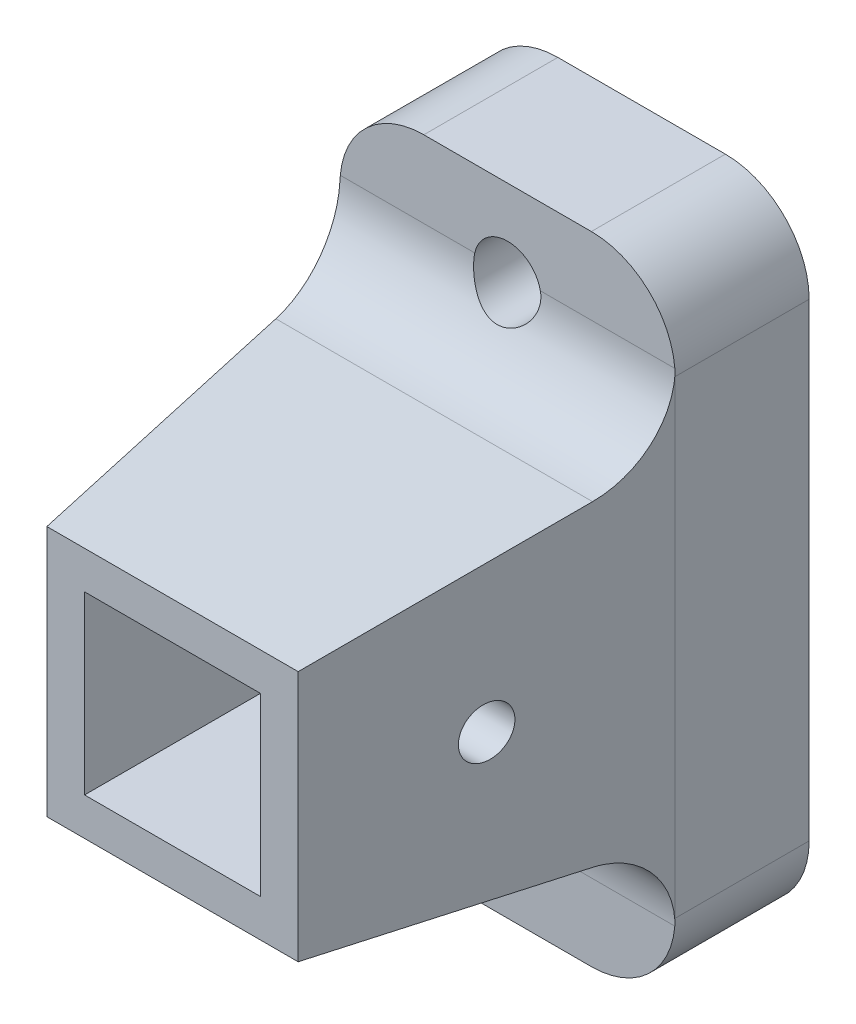
ISO-10303-21;
HEADER;
FILE_DESCRIPTION(('STEP AP214'),'2;1');
FILE_NAME('part.step','',(''),(''),'','','');
FILE_SCHEMA(('AUTOMOTIVE_DESIGN { 1 0 10303 214 1 1 1 1 }'));
ENDSEC;
DATA;
#1=APPLICATION_CONTEXT('core data for automotive mechanical design processes');
#2=APPLICATION_PROTOCOL_DEFINITION('international standard','automotive_design',2000,#1);
#3=PRODUCT_CONTEXT('',#1,'mechanical');
#4=PRODUCT('Part','Part','',(#3));
#5=PRODUCT_RELATED_PRODUCT_CATEGORY('part','',(#4));
#6=PRODUCT_DEFINITION_FORMATION('','',#4);
#7=PRODUCT_DEFINITION_CONTEXT('part definition',#1,'design');
#8=PRODUCT_DEFINITION('design','',#6,#7);
#9=PRODUCT_DEFINITION_SHAPE('','',#8);
#10=(LENGTH_UNIT() NAMED_UNIT(*) SI_UNIT(.MILLI.,.METRE.));
#11=(NAMED_UNIT(*) PLANE_ANGLE_UNIT() SI_UNIT($,.RADIAN.));
#12=(NAMED_UNIT(*) SI_UNIT($,.STERADIAN.) SOLID_ANGLE_UNIT());
#13=UNCERTAINTY_MEASURE_WITH_UNIT(LENGTH_MEASURE(1.E-05),#10,'distance_accuracy_value','');
#14=(GEOMETRIC_REPRESENTATION_CONTEXT(3) GLOBAL_UNCERTAINTY_ASSIGNED_CONTEXT((#13)) GLOBAL_UNIT_ASSIGNED_CONTEXT((#10,
#11,#12)) REPRESENTATION_CONTEXT('',''));
#15=CARTESIAN_POINT('',(0.,0.,0.));
#16=DIRECTION('',(0.,0.,1.));
#17=DIRECTION('',(1.,0.,0.));
#18=AXIS2_PLACEMENT_3D('',#15,#16,#17);
#19=CARTESIAN_POINT('',(0.,0.,20.));
#20=DIRECTION('',(0.,0.,1.));
#21=DIRECTION('',(1.,0.,0.));
#22=AXIS2_PLACEMENT_3D('',#19,#20,#21);
#23=PLANE('',#22);
#24=DIRECTION('',(0.,1.,0.));
#25=VECTOR('',#24,1.);
#26=CARTESIAN_POINT('',(5.25,5.25,20.));
#27=LINE('',#26,#25);
#28=CARTESIAN_POINT('',(5.25,-5.25,20.));
#29=VERTEX_POINT('',#28);
#30=CARTESIAN_POINT('',(5.25,5.25,20.));
#31=VERTEX_POINT('',#30);
#32=EDGE_CURVE('E654',#29,#31,#27,.T.);
#33=ORIENTED_EDGE('',*,*,#32,.F.);
#34=DIRECTION('',(1.,0.,0.));
#35=VECTOR('',#34,1.);
#36=CARTESIAN_POINT('',(-5.25,-5.25,20.));
#37=LINE('',#36,#35);
#38=CARTESIAN_POINT('',(-5.25,-5.25,20.));
#39=VERTEX_POINT('',#38);
#40=EDGE_CURVE('E641',#39,#29,#37,.T.);
#41=ORIENTED_EDGE('',*,*,#40,.F.);
#42=DIRECTION('',(0.,-1.,0.));
#43=VECTOR('',#42,1.);
#44=CARTESIAN_POINT('',(-5.25,5.25,20.));
#45=LINE('',#44,#43);
#46=CARTESIAN_POINT('',(-5.25,5.25,20.));
#47=VERTEX_POINT('',#46);
#48=EDGE_CURVE('E646',#47,#39,#45,.T.);
#49=ORIENTED_EDGE('',*,*,#48,.F.);
#50=DIRECTION('',(-1.,0.,0.));
#51=VECTOR('',#50,1.);
#52=CARTESIAN_POINT('',(-5.25,5.25,20.));
#53=LINE('',#52,#51);
#54=EDGE_CURVE('E650',#31,#47,#53,.T.);
#55=ORIENTED_EDGE('',*,*,#54,.F.);
#56=EDGE_LOOP('',(#33,#41,#49,#55));
#57=FACE_BOUND('',#56,.T.);
#58=DIRECTION('',(0.,1.,0.));
#59=VECTOR('',#58,1.);
#60=CARTESIAN_POINT('',(7.5,7.5,20.));
#61=LINE('',#60,#59);
#62=CARTESIAN_POINT('',(7.5,-7.5,20.));
#63=VERTEX_POINT('',#62);
#64=CARTESIAN_POINT('',(7.5,7.5,20.));
#65=VERTEX_POINT('',#64);
#66=EDGE_CURVE('E640',#63,#65,#61,.T.);
#67=ORIENTED_EDGE('',*,*,#66,.T.);
#68=DIRECTION('',(-1.,0.,0.));
#69=VECTOR('',#68,1.);
#70=CARTESIAN_POINT('',(-7.5,7.5,20.));
#71=LINE('',#70,#69);
#72=CARTESIAN_POINT('',(-7.5,7.5,20.));
#73=VERTEX_POINT('',#72);
#74=EDGE_CURVE('E571',#65,#73,#71,.T.);
#75=ORIENTED_EDGE('',*,*,#74,.T.);
#76=DIRECTION('',(0.,-1.,0.));
#77=VECTOR('',#76,1.);
#78=CARTESIAN_POINT('',(-7.5,7.5,20.));
#79=LINE('',#78,#77);
#80=CARTESIAN_POINT('',(-7.5,-7.5,20.));
#81=VERTEX_POINT('',#80);
#82=EDGE_CURVE('E596',#73,#81,#79,.T.);
#83=ORIENTED_EDGE('',*,*,#82,.T.);
#84=DIRECTION('',(1.,0.,0.));
#85=VECTOR('',#84,1.);
#86=CARTESIAN_POINT('',(-7.5,-7.5,20.));
#87=LINE('',#86,#85);
#88=EDGE_CURVE('E579',#81,#63,#87,.T.);
#89=ORIENTED_EDGE('',*,*,#88,.T.);
#90=EDGE_LOOP('',(#67,#75,#83,#89));
#91=FACE_BOUND('',#90,.T.);
#92=ADVANCED_FACE('F47',(#57,#91),#23,.T.);
#93=CARTESIAN_POINT('',(9.84615384615385,0.,1.23076923076923));
#94=DIRECTION('',(0.992277876713668,0.,0.124034734589209));
#95=DIRECTION('',(0.124034734589209,0.,-0.992277876713668));
#96=AXIS2_PLACEMENT_3D('',#93,#94,#95);
#97=PLANE('',#96);
#98=CARTESIAN_POINT('',(8.75,0.,10.));
#99=DIRECTION('',(0.992277876713668,0.,0.124034734589209));
#100=DIRECTION('',(-0.124034734589209,0.,0.992277876713668));
#101=AXIS2_PLACEMENT_3D('',#98,#99,#100);
#102=ELLIPSE('',#101,1.51167332780598,1.5);
#103=CARTESIAN_POINT('',(8.5625,0.,11.5));
#104=VERTEX_POINT('',#103);
#105=EDGE_CURVE('E657',#104,#104,#102,.F.);
#106=ORIENTED_EDGE('',*,*,#105,.T.);
#107=EDGE_LOOP('',(#106));
#108=FACE_BOUND('',#107,.T.);
#109=CARTESIAN_POINT('',(9.37500000000001,-14.4139110926866,5.));
#110=DIRECTION('',(0.992277876713668,0.,0.124034734589209));
#111=DIRECTION('',(0.124034734589209,0.,-0.992277876713668));
#112=AXIS2_PLACEMENT_3D('',#109,#110,#111);
#113=ELLIPSE('',#112,5.03891109268659,5.);
#114=CARTESIAN_POINT('',(9.45252170911826,-9.45252170911826,4.37982632705396));
#115=VERTEX_POINT('',#114);
#116=CARTESIAN_POINT('',(9.99883026627728,-14.1081479031239,0.0093578697818249));
#117=VERTEX_POINT('',#116);
#118=EDGE_CURVE('E287',#115,#117,#113,.F.);
#119=ORIENTED_EDGE('',*,*,#118,.T.);
#120=CARTESIAN_POINT('',(5.,-14.,40.));
#121=DIRECTION('',(0.992277876713668,0.,0.124034734589209));
#122=DIRECTION('',(-0.124034734589209,0.,0.992277876713668));
#123=AXIS2_PLACEMENT_3D('',#120,#121,#122);
#124=ELLIPSE('',#123,40.3112887414927,5.);
#125=CARTESIAN_POINT('',(10.,-14.,0.));
#126=VERTEX_POINT('',#125);
#127=EDGE_CURVE('E416',#117,#126,#124,.T.);
#128=ORIENTED_EDGE('',*,*,#127,.T.);
#129=DIRECTION('',(0.,1.,0.));
#130=VECTOR('',#129,1.);
#131=CARTESIAN_POINT('',(10.,0.,0.));
#132=LINE('',#131,#130);
#133=CARTESIAN_POINT('',(10.,-10.,0.));
#134=VERTEX_POINT('',#133);
#135=EDGE_CURVE('E229',#134,#126,#132,.F.);
#136=ORIENTED_EDGE('',*,*,#135,.F.);
#137=DIRECTION('',(0.,1.,0.));
#138=VECTOR('',#137,1.);
#139=CARTESIAN_POINT('',(10.,10.,0.));
#140=LINE('',#139,#138);
#141=CARTESIAN_POINT('',(10.,10.,0.));
#142=VERTEX_POINT('',#141);
#143=EDGE_CURVE('E238',#134,#142,#140,.T.);
#144=ORIENTED_EDGE('',*,*,#143,.T.);
#145=DIRECTION('',(0.,-1.,0.));
#146=VECTOR('',#145,1.);
#147=CARTESIAN_POINT('',(10.,19.,0.));
#148=LINE('',#147,#146);
#149=CARTESIAN_POINT('',(10.,14.,0.));
#150=VERTEX_POINT('',#149);
#151=EDGE_CURVE('E438',#142,#150,#148,.F.);
#152=ORIENTED_EDGE('',*,*,#151,.T.);
#153=CARTESIAN_POINT('',(5.00000000000001,14.,39.9999999999999));
#154=DIRECTION('',(0.992277876713668,0.,0.124034734589209));
#155=DIRECTION('',(-0.124034734589209,0.,0.992277876713668));
#156=AXIS2_PLACEMENT_3D('',#153,#154,#155);
#157=ELLIPSE('',#156,40.3112887414927,5.);
#158=CARTESIAN_POINT('',(9.9988302662776,14.1081479031663,0.00935786977924274));
#159=VERTEX_POINT('',#158);
#160=EDGE_CURVE('E468',#150,#159,#157,.T.);
#161=ORIENTED_EDGE('',*,*,#160,.T.);
#162=CARTESIAN_POINT('',(9.375,14.4139110926866,5.));
#163=DIRECTION('',(0.992277876713668,0.,0.124034734589209));
#164=DIRECTION('',(-0.124034734589209,0.,0.992277876713668));
#165=AXIS2_PLACEMENT_3D('',#162,#163,#164);
#166=ELLIPSE('',#165,5.03891109268659,5.);
#167=CARTESIAN_POINT('',(9.45252170911826,9.45252170911825,4.37982632705396));
#168=VERTEX_POINT('',#167);
#169=EDGE_CURVE('E419',#159,#168,#166,.F.);
#170=ORIENTED_EDGE('',*,*,#169,.T.);
#171=DIRECTION('',(0.123091490979333,0.123091490979333,-0.984731927834662));
#172=VECTOR('',#171,1.);
#173=CARTESIAN_POINT('',(7.5,7.5,20.));
#174=LINE('',#173,#172);
#175=EDGE_CURVE('E570',#65,#168,#174,.T.);
#176=ORIENTED_EDGE('',*,*,#175,.F.);
#177=ORIENTED_EDGE('',*,*,#66,.F.);
#178=DIRECTION('',(0.123091490979333,-0.123091490979333,-0.984731927834662));
#179=VECTOR('',#178,1.);
#180=CARTESIAN_POINT('',(7.5,-7.5,20.));
#181=LINE('',#180,#179);
#182=EDGE_CURVE('E561',#63,#115,#181,.T.);
#183=ORIENTED_EDGE('',*,*,#182,.T.);
#184=EDGE_LOOP('',(#119,#128,#136,#144,#152,#161,#170,#176,#177,#183));
#185=FACE_BOUND('',#184,.T.);
#186=ADVANCED_FACE('F413',(#108,#185),#97,.T.);
#187=CARTESIAN_POINT('',(0.,9.84615384615384,1.23076923076923));
#188=DIRECTION('',(0.,0.992277876713668,0.124034734589208));
#189=DIRECTION('',(0.,-0.124034734589208,0.992277876713668));
#190=AXIS2_PLACEMENT_3D('',#187,#188,#189);
#191=PLANE('',#190);
#192=ORIENTED_EDGE('',*,*,#175,.T.);
#193=DIRECTION('',(-1.,0.,0.));
#194=VECTOR('',#193,1.);
#195=CARTESIAN_POINT('',(0.,9.45252170911825,4.37982632705396));
#196=LINE('',#195,#194);
#197=CARTESIAN_POINT('',(-9.45252170911825,9.45252170911825,4.37982632705396));
#198=VERTEX_POINT('',#197);
#199=EDGE_CURVE('E303',#168,#198,#196,.T.);
#200=ORIENTED_EDGE('',*,*,#199,.T.);
#201=DIRECTION('',(-0.123091490979333,0.123091490979333,-0.984731927834662));
#202=VECTOR('',#201,1.);
#203=CARTESIAN_POINT('',(-7.5,7.5,20.));
#204=LINE('',#203,#202);
#205=EDGE_CURVE('E592',#73,#198,#204,.T.);
#206=ORIENTED_EDGE('',*,*,#205,.F.);
#207=ORIENTED_EDGE('',*,*,#74,.F.);
#208=EDGE_LOOP('',(#192,#200,#206,#207));
#209=FACE_BOUND('',#208,.T.);
#210=ADVANCED_FACE('F546',(#209),#191,.T.);
#211=CARTESIAN_POINT('',(0.,-9.84615384615385,1.23076923076923));
#212=DIRECTION('',(0.,-0.992277876713668,0.124034734589209));
#213=DIRECTION('',(0.,-0.124034734589209,-0.992277876713668));
#214=AXIS2_PLACEMENT_3D('',#211,#212,#213);
#215=PLANE('',#214);
#216=DIRECTION('',(-0.123091490979332,-0.123091490979333,-0.984731927834662));
#217=VECTOR('',#216,1.);
#218=CARTESIAN_POINT('',(-7.5,-7.5,20.));
#219=LINE('',#218,#217);
#220=CARTESIAN_POINT('',(-9.45252170911825,-9.45252170911826,4.37982632705396));
#221=VERTEX_POINT('',#220);
#222=EDGE_CURVE('E584',#81,#221,#219,.T.);
#223=ORIENTED_EDGE('',*,*,#222,.T.);
#224=DIRECTION('',(1.,0.,0.));
#225=VECTOR('',#224,1.);
#226=CARTESIAN_POINT('',(0.,-9.45252170911826,4.37982632705396));
#227=LINE('',#226,#225);
#228=EDGE_CURVE('E237',#221,#115,#227,.T.);
#229=ORIENTED_EDGE('',*,*,#228,.T.);
#230=ORIENTED_EDGE('',*,*,#182,.F.);
#231=ORIENTED_EDGE('',*,*,#88,.F.);
#232=EDGE_LOOP('',(#223,#229,#230,#231));
#233=FACE_BOUND('',#232,.T.);
#234=ADVANCED_FACE('F262',(#233),#215,.T.);
#235=CARTESIAN_POINT('',(-9.84615384615384,0.,1.23076923076923));
#236=DIRECTION('',(-0.992277876713668,0.,0.124034734589208));
#237=DIRECTION('',(0.124034734589208,0.,0.992277876713668));
#238=AXIS2_PLACEMENT_3D('',#235,#236,#237);
#239=PLANE('',#238);
#240=CARTESIAN_POINT('',(-8.75,0.,10.));
#241=DIRECTION('',(-0.992277876713668,0.,0.124034734589208));
#242=DIRECTION('',(-0.124034734589208,0.,-0.992277876713668));
#243=AXIS2_PLACEMENT_3D('',#240,#241,#242);
#244=ELLIPSE('',#243,1.51167332780598,1.5);
#245=CARTESIAN_POINT('',(-8.9375,0.,8.5));
#246=VERTEX_POINT('',#245);
#247=EDGE_CURVE('E675',#246,#246,#244,.F.);
#248=ORIENTED_EDGE('',*,*,#247,.T.);
#249=EDGE_LOOP('',(#248));
#250=FACE_BOUND('',#249,.T.);
#251=DIRECTION('',(0.,1.,0.));
#252=VECTOR('',#251,1.);
#253=CARTESIAN_POINT('',(-9.99999999999999,19.,0.));
#254=LINE('',#253,#252);
#255=CARTESIAN_POINT('',(-9.99999999999999,-10.,0.));
#256=VERTEX_POINT('',#255);
#257=CARTESIAN_POINT('',(-9.99999999999999,-14.,0.));
#258=VERTEX_POINT('',#257);
#259=EDGE_CURVE('E216',#256,#258,#254,.F.);
#260=ORIENTED_EDGE('',*,*,#259,.T.);
#261=CARTESIAN_POINT('',(-4.99999999999999,-14.,40.0000000000001));
#262=DIRECTION('',(-0.992277876713668,0.,0.124034734589208));
#263=DIRECTION('',(0.124034734589208,0.,0.992277876713668));
#264=AXIS2_PLACEMENT_3D('',#261,#262,#263);
#265=ELLIPSE('',#264,40.3112887414928,5.);
#266=CARTESIAN_POINT('',(-9.99883026627744,-14.1081479031469,0.00935786978043103));
#267=VERTEX_POINT('',#266);
#268=EDGE_CURVE('E512',#258,#267,#265,.T.);
#269=ORIENTED_EDGE('',*,*,#268,.T.);
#270=CARTESIAN_POINT('',(-9.37499999999999,-14.4139110926866,5.));
#271=DIRECTION('',(-0.992277876713668,0.,0.124034734589208));
#272=DIRECTION('',(0.124034734589208,0.,0.992277876713668));
#273=AXIS2_PLACEMENT_3D('',#270,#271,#272);
#274=ELLIPSE('',#273,5.03891109268659,5.);
#275=EDGE_CURVE('E314',#267,#221,#274,.F.);
#276=ORIENTED_EDGE('',*,*,#275,.T.);
#277=ORIENTED_EDGE('',*,*,#222,.F.);
#278=ORIENTED_EDGE('',*,*,#82,.F.);
#279=ORIENTED_EDGE('',*,*,#205,.T.);
#280=CARTESIAN_POINT('',(-9.375,14.4139110926866,5.));
#281=DIRECTION('',(-0.992277876713668,0.,0.124034734589208));
#282=DIRECTION('',(-0.124034734589208,0.,-0.992277876713668));
#283=AXIS2_PLACEMENT_3D('',#280,#281,#282);
#284=ELLIPSE('',#283,5.03891109268659,5.);
#285=CARTESIAN_POINT('',(-9.99883026627727,14.1081479031236,0.00935786978183878));
#286=VERTEX_POINT('',#285);
#287=EDGE_CURVE('E318',#198,#286,#284,.F.);
#288=ORIENTED_EDGE('',*,*,#287,.T.);
#289=CARTESIAN_POINT('',(-4.99999999999999,14.,40.0000000000001));
#290=DIRECTION('',(-0.992277876713668,0.,0.124034734589208));
#291=DIRECTION('',(0.124034734589208,0.,0.992277876713668));
#292=AXIS2_PLACEMENT_3D('',#289,#290,#291);
#293=ELLIPSE('',#292,40.3112887414928,5.);
#294=CARTESIAN_POINT('',(-9.99999999999999,14.,0.));
#295=VERTEX_POINT('',#294);
#296=EDGE_CURVE('E507',#286,#295,#293,.T.);
#297=ORIENTED_EDGE('',*,*,#296,.T.);
#298=DIRECTION('',(0.,1.,0.));
#299=VECTOR('',#298,1.);
#300=CARTESIAN_POINT('',(-9.99999999999999,0.,0.));
#301=LINE('',#300,#299);
#302=CARTESIAN_POINT('',(-10.,10.,0.));
#303=VERTEX_POINT('',#302);
#304=EDGE_CURVE('E52',#303,#295,#301,.T.);
#305=ORIENTED_EDGE('',*,*,#304,.F.);
#306=DIRECTION('',(0.,-1.,0.));
#307=VECTOR('',#306,1.);
#308=CARTESIAN_POINT('',(-10.,10.,0.));
#309=LINE('',#308,#307);
#310=EDGE_CURVE('E222',#303,#256,#309,.T.);
#311=ORIENTED_EDGE('',*,*,#310,.T.);
#312=EDGE_LOOP('',(#260,#269,#276,#277,#278,#279,#288,#297,#305,#311));
#313=FACE_BOUND('',#312,.T.);
#314=ADVANCED_FACE('F234',(#250,#313),#239,.T.);
#315=CARTESIAN_POINT('',(5.25,5.25,0.));
#316=DIRECTION('',(1.,0.,0.));
#317=DIRECTION('',(0.,1.,0.));
#318=AXIS2_PLACEMENT_3D('',#315,#316,#317);
#319=PLANE('',#318);
#320=CARTESIAN_POINT('',(5.25,0.,10.));
#321=DIRECTION('',(1.,0.,0.));
#322=DIRECTION('',(0.,1.,0.));
#323=AXIS2_PLACEMENT_3D('',#320,#321,#322);
#324=CIRCLE('',#323,1.5);
#325=CARTESIAN_POINT('',(5.25,1.5,10.));
#326=VERTEX_POINT('',#325);
#327=EDGE_CURVE('E380',#326,#326,#324,.F.);
#328=ORIENTED_EDGE('',*,*,#327,.F.);
#329=EDGE_LOOP('',(#328));
#330=FACE_BOUND('',#329,.T.);
#331=ORIENTED_EDGE('',*,*,#32,.T.);
#332=DIRECTION('',(0.,0.,1.));
#333=VECTOR('',#332,1.);
#334=CARTESIAN_POINT('',(5.25,5.25,0.));
#335=LINE('',#334,#333);
#336=CARTESIAN_POINT('',(5.25,5.25,0.));
#337=VERTEX_POINT('',#336);
#338=EDGE_CURVE('E626',#337,#31,#335,.T.);
#339=ORIENTED_EDGE('',*,*,#338,.F.);
#340=DIRECTION('',(0.,1.,0.));
#341=VECTOR('',#340,1.);
#342=CARTESIAN_POINT('',(5.25,5.25,0.));
#343=LINE('',#342,#341);
#344=CARTESIAN_POINT('',(5.25,-5.25,0.));
#345=VERTEX_POINT('',#344);
#346=EDGE_CURVE('E645',#345,#337,#343,.T.);
#347=ORIENTED_EDGE('',*,*,#346,.F.);
#348=DIRECTION('',(0.,0.,1.));
#349=VECTOR('',#348,1.);
#350=CARTESIAN_POINT('',(5.25,-5.25,0.));
#351=LINE('',#350,#349);
#352=EDGE_CURVE('E637',#345,#29,#351,.T.);
#353=ORIENTED_EDGE('',*,*,#352,.T.);
#354=EDGE_LOOP('',(#331,#339,#347,#353));
#355=FACE_BOUND('',#354,.T.);
#356=ADVANCED_FACE('F261',(#330,#355),#319,.F.);
#357=CARTESIAN_POINT('',(-5.25,-5.25,0.));
#358=DIRECTION('',(0.,-1.,0.));
#359=DIRECTION('',(0.,0.,-1.));
#360=AXIS2_PLACEMENT_3D('',#357,#358,#359);
#361=PLANE('',#360);
#362=ORIENTED_EDGE('',*,*,#40,.T.);
#363=ORIENTED_EDGE('',*,*,#352,.F.);
#364=DIRECTION('',(1.,0.,0.));
#365=VECTOR('',#364,1.);
#366=CARTESIAN_POINT('',(-5.25,-5.25,0.));
#367=LINE('',#366,#365);
#368=CARTESIAN_POINT('',(-5.25,-5.25,0.));
#369=VERTEX_POINT('',#368);
#370=EDGE_CURVE('E631',#369,#345,#367,.T.);
#371=ORIENTED_EDGE('',*,*,#370,.F.);
#372=DIRECTION('',(0.,0.,1.));
#373=VECTOR('',#372,1.);
#374=CARTESIAN_POINT('',(-5.25,-5.25,0.));
#375=LINE('',#374,#373);
#376=EDGE_CURVE('E634',#369,#39,#375,.T.);
#377=ORIENTED_EDGE('',*,*,#376,.T.);
#378=EDGE_LOOP('',(#362,#363,#371,#377));
#379=FACE_BOUND('',#378,.T.);
#380=ADVANCED_FACE('F998',(#379),#361,.F.);
#381=CARTESIAN_POINT('',(-5.25,5.25,0.));
#382=DIRECTION('',(-1.,0.,0.));
#383=DIRECTION('',(0.,-1.,0.));
#384=AXIS2_PLACEMENT_3D('',#381,#382,#383);
#385=PLANE('',#384);
#386=CARTESIAN_POINT('',(-5.25,0.,10.));
#387=DIRECTION('',(-1.,0.,0.));
#388=DIRECTION('',(0.,-1.,0.));
#389=AXIS2_PLACEMENT_3D('',#386,#387,#388);
#390=CIRCLE('',#389,1.5);
#391=CARTESIAN_POINT('',(-5.25,-1.5,10.));
#392=VERTEX_POINT('',#391);
#393=EDGE_CURVE('E376',#392,#392,#390,.F.);
#394=ORIENTED_EDGE('',*,*,#393,.F.);
#395=EDGE_LOOP('',(#394));
#396=FACE_BOUND('',#395,.T.);
#397=ORIENTED_EDGE('',*,*,#48,.T.);
#398=ORIENTED_EDGE('',*,*,#376,.F.);
#399=DIRECTION('',(0.,-1.,0.));
#400=VECTOR('',#399,1.);
#401=CARTESIAN_POINT('',(-5.25,5.25,0.));
#402=LINE('',#401,#400);
#403=CARTESIAN_POINT('',(-5.25,5.25,0.));
#404=VERTEX_POINT('',#403);
#405=EDGE_CURVE('E661',#404,#369,#402,.T.);
#406=ORIENTED_EDGE('',*,*,#405,.F.);
#407=DIRECTION('',(0.,0.,1.));
#408=VECTOR('',#407,1.);
#409=CARTESIAN_POINT('',(-5.25,5.25,0.));
#410=LINE('',#409,#408);
#411=EDGE_CURVE('E630',#404,#47,#410,.T.);
#412=ORIENTED_EDGE('',*,*,#411,.T.);
#413=EDGE_LOOP('',(#397,#398,#406,#412));
#414=FACE_BOUND('',#413,.T.);
#415=ADVANCED_FACE('F986',(#396,#414),#385,.F.);
#416=CARTESIAN_POINT('',(-5.25,5.25,0.));
#417=DIRECTION('',(0.,1.,0.));
#418=DIRECTION('',(0.,0.,1.));
#419=AXIS2_PLACEMENT_3D('',#416,#417,#418);
#420=PLANE('',#419);
#421=ORIENTED_EDGE('',*,*,#54,.T.);
#422=ORIENTED_EDGE('',*,*,#411,.F.);
#423=DIRECTION('',(-1.,0.,0.));
#424=VECTOR('',#423,1.);
#425=CARTESIAN_POINT('',(-5.25,5.25,0.));
#426=LINE('',#425,#424);
#427=EDGE_CURVE('E665',#337,#404,#426,.T.);
#428=ORIENTED_EDGE('',*,*,#427,.F.);
#429=ORIENTED_EDGE('',*,*,#338,.T.);
#430=EDGE_LOOP('',(#421,#422,#428,#429));
#431=FACE_BOUND('',#430,.T.);
#432=ADVANCED_FACE('F980',(#431),#420,.F.);
#433=CARTESIAN_POINT('',(20.,0.,10.));
#434=DIRECTION('',(-1.,0.,0.));
#435=DIRECTION('',(0.,0.,1.));
#436=AXIS2_PLACEMENT_3D('',#433,#434,#435);
#437=CYLINDRICAL_SURFACE('',#436,1.5);
#438=ORIENTED_EDGE('',*,*,#247,.F.);
#439=EDGE_LOOP('',(#438));
#440=FACE_BOUND('',#439,.T.);
#441=ORIENTED_EDGE('',*,*,#393,.T.);
#442=EDGE_LOOP('',(#441));
#443=FACE_BOUND('',#442,.T.);
#444=ADVANCED_FACE('F985',(#440,#443),#437,.F.);
#445=ORIENTED_EDGE('',*,*,#105,.F.);
#446=EDGE_LOOP('',(#445));
#447=FACE_BOUND('',#446,.T.);
#448=ORIENTED_EDGE('',*,*,#327,.T.);
#449=EDGE_LOOP('',(#448));
#450=FACE_BOUND('',#449,.T.);
#451=ADVANCED_FACE('F351',(#447,#450),#437,.F.);
#452=CARTESIAN_POINT('',(0.,0.,-8.));
#453=DIRECTION('',(0.,0.,-1.));
#454=DIRECTION('',(-1.,0.,0.));
#455=AXIS2_PLACEMENT_3D('',#452,#453,#454);
#456=PLANE('',#455);
#457=CARTESIAN_POINT('',(0.,14.,-8.));
#458=DIRECTION('',(0.,0.,-1.));
#459=DIRECTION('',(-1.,0.,0.));
#460=AXIS2_PLACEMENT_3D('',#457,#458,#459);
#461=CIRCLE('',#460,2.);
#462=CARTESIAN_POINT('',(-2.,14.,-8.));
#463=VERTEX_POINT('',#462);
#464=EDGE_CURVE('E707',#463,#463,#461,.T.);
#465=ORIENTED_EDGE('',*,*,#464,.F.);
#466=EDGE_LOOP('',(#465));
#467=FACE_BOUND('',#466,.T.);
#468=CARTESIAN_POINT('',(0.,-14.,-8.));
#469=DIRECTION('',(0.,0.,-1.));
#470=DIRECTION('',(1.,0.,0.));
#471=AXIS2_PLACEMENT_3D('',#468,#469,#470);
#472=CIRCLE('',#471,2.);
#473=CARTESIAN_POINT('',(2.,-14.,-8.));
#474=VERTEX_POINT('',#473);
#475=EDGE_CURVE('E703',#474,#474,#472,.T.);
#476=ORIENTED_EDGE('',*,*,#475,.F.);
#477=EDGE_LOOP('',(#476));
#478=FACE_BOUND('',#477,.T.);
#479=DIRECTION('',(0.,-1.,0.));
#480=VECTOR('',#479,1.);
#481=CARTESIAN_POINT('',(10.,19.,-8.));
#482=LINE('',#481,#480);
#483=CARTESIAN_POINT('',(10.,14.,-8.));
#484=VERTEX_POINT('',#483);
#485=CARTESIAN_POINT('',(10.,-14.,-8.));
#486=VERTEX_POINT('',#485);
#487=EDGE_CURVE('E692',#484,#486,#482,.T.);
#488=ORIENTED_EDGE('',*,*,#487,.T.);
#489=CARTESIAN_POINT('',(5.,-14.,-8.));
#490=DIRECTION('',(0.,0.,-1.));
#491=DIRECTION('',(-1.,0.,0.));
#492=AXIS2_PLACEMENT_3D('',#489,#490,#491);
#493=CIRCLE('',#492,5.);
#494=CARTESIAN_POINT('',(5.,-19.,-8.));
#495=VERTEX_POINT('',#494);
#496=EDGE_CURVE('E497',#486,#495,#493,.T.);
#497=ORIENTED_EDGE('',*,*,#496,.T.);
#498=DIRECTION('',(-1.,0.,0.));
#499=VECTOR('',#498,1.);
#500=CARTESIAN_POINT('',(10.,-19.,-8.));
#501=LINE('',#500,#499);
#502=CARTESIAN_POINT('',(-4.99999999999999,-19.,-8.));
#503=VERTEX_POINT('',#502);
#504=EDGE_CURVE('E381',#495,#503,#501,.T.);
#505=ORIENTED_EDGE('',*,*,#504,.T.);
#506=CARTESIAN_POINT('',(-4.99999999999999,-14.,-8.));
#507=DIRECTION('',(0.,0.,-1.));
#508=DIRECTION('',(-1.,0.,0.));
#509=AXIS2_PLACEMENT_3D('',#506,#507,#508);
#510=CIRCLE('',#509,5.);
#511=CARTESIAN_POINT('',(-9.99999999999999,-14.,-8.));
#512=VERTEX_POINT('',#511);
#513=EDGE_CURVE('E494',#503,#512,#510,.T.);
#514=ORIENTED_EDGE('',*,*,#513,.T.);
#515=DIRECTION('',(0.,1.,0.));
#516=VECTOR('',#515,1.);
#517=CARTESIAN_POINT('',(-9.99999999999999,19.,-8.));
#518=LINE('',#517,#516);
#519=CARTESIAN_POINT('',(-9.99999999999999,14.,-8.));
#520=VERTEX_POINT('',#519);
#521=EDGE_CURVE('E685',#512,#520,#518,.T.);
#522=ORIENTED_EDGE('',*,*,#521,.T.);
#523=CARTESIAN_POINT('',(-4.99999999999999,14.,-8.));
#524=DIRECTION('',(0.,0.,-1.));
#525=DIRECTION('',(-1.,0.,0.));
#526=AXIS2_PLACEMENT_3D('',#523,#524,#525);
#527=CIRCLE('',#526,5.);
#528=CARTESIAN_POINT('',(-4.99999999999999,19.,-8.));
#529=VERTEX_POINT('',#528);
#530=EDGE_CURVE('E486',#520,#529,#527,.T.);
#531=ORIENTED_EDGE('',*,*,#530,.T.);
#532=DIRECTION('',(1.,0.,0.));
#533=VECTOR('',#532,1.);
#534=CARTESIAN_POINT('',(10.,19.,-8.));
#535=LINE('',#534,#533);
#536=CARTESIAN_POINT('',(5.00000000000001,19.,-8.));
#537=VERTEX_POINT('',#536);
#538=EDGE_CURVE('E696',#529,#537,#535,.T.);
#539=ORIENTED_EDGE('',*,*,#538,.T.);
#540=CARTESIAN_POINT('',(5.00000000000001,14.,-8.));
#541=DIRECTION('',(0.,0.,-1.));
#542=DIRECTION('',(-1.,0.,0.));
#543=AXIS2_PLACEMENT_3D('',#540,#541,#542);
#544=CIRCLE('',#543,5.);
#545=EDGE_CURVE('E491',#537,#484,#544,.T.);
#546=ORIENTED_EDGE('',*,*,#545,.T.);
#547=EDGE_LOOP('',(#488,#497,#505,#514,#522,#531,#539,#546));
#548=FACE_BOUND('',#547,.T.);
#549=ADVANCED_FACE('F740',(#467,#478,#548),#456,.T.);
#550=CARTESIAN_POINT('',(10.,-19.,-8.));
#551=DIRECTION('',(0.,1.,0.));
#552=DIRECTION('',(0.,0.,1.));
#553=AXIS2_PLACEMENT_3D('',#550,#551,#552);
#554=PLANE('',#553);
#555=ORIENTED_EDGE('',*,*,#504,.F.);
#556=DIRECTION('',(0.,0.,1.));
#557=VECTOR('',#556,1.);
#558=CARTESIAN_POINT('',(5.,-19.,-8.));
#559=LINE('',#558,#557);
#560=CARTESIAN_POINT('',(5.,-19.,0.));
#561=VERTEX_POINT('',#560);
#562=EDGE_CURVE('E305',#495,#561,#559,.T.);
#563=ORIENTED_EDGE('',*,*,#562,.T.);
#564=DIRECTION('',(-1.,0.,0.));
#565=VECTOR('',#564,1.);
#566=CARTESIAN_POINT('',(10.,-19.,0.));
#567=LINE('',#566,#565);
#568=CARTESIAN_POINT('',(-4.99999999999999,-19.,0.));
#569=VERTEX_POINT('',#568);
#570=EDGE_CURVE('E682',#561,#569,#567,.T.);
#571=ORIENTED_EDGE('',*,*,#570,.T.);
#572=DIRECTION('',(0.,0.,1.));
#573=VECTOR('',#572,1.);
#574=CARTESIAN_POINT('',(-4.99999999999999,-19.,-8.));
#575=LINE('',#574,#573);
#576=EDGE_CURVE('E440',#569,#503,#575,.F.);
#577=ORIENTED_EDGE('',*,*,#576,.T.);
#578=EDGE_LOOP('',(#555,#563,#571,#577));
#579=FACE_BOUND('',#578,.T.);
#580=ADVANCED_FACE('F397',(#579),#554,.F.);
#581=CARTESIAN_POINT('',(10.,19.,-8.));
#582=DIRECTION('',(-1.,0.,0.));
#583=DIRECTION('',(0.,-1.,0.));
#584=AXIS2_PLACEMENT_3D('',#581,#582,#583);
#585=PLANE('',#584);
#586=ORIENTED_EDGE('',*,*,#135,.T.);
#587=DIRECTION('',(0.,0.,1.));
#588=VECTOR('',#587,1.);
#589=CARTESIAN_POINT('',(10.,-14.,-8.));
#590=LINE('',#589,#588);
#591=EDGE_CURVE('E481',#126,#486,#590,.F.);
#592=ORIENTED_EDGE('',*,*,#591,.T.);
#593=ORIENTED_EDGE('',*,*,#487,.F.);
#594=DIRECTION('',(0.,0.,1.));
#595=VECTOR('',#594,1.);
#596=CARTESIAN_POINT('',(10.,14.,-8.));
#597=LINE('',#596,#595);
#598=EDGE_CURVE('E475',#484,#150,#597,.T.);
#599=ORIENTED_EDGE('',*,*,#598,.T.);
#600=ORIENTED_EDGE('',*,*,#151,.F.);
#601=ORIENTED_EDGE('',*,*,#143,.F.);
#602=EDGE_LOOP('',(#586,#592,#593,#599,#600,#601));
#603=FACE_BOUND('',#602,.T.);
#604=ADVANCED_FACE('F388',(#603),#585,.F.);
#605=CARTESIAN_POINT('',(10.,19.,-8.));
#606=DIRECTION('',(0.,-1.,0.));
#607=DIRECTION('',(0.,0.,-1.));
#608=AXIS2_PLACEMENT_3D('',#605,#606,#607);
#609=PLANE('',#608);
#610=DIRECTION('',(1.,0.,0.));
#611=VECTOR('',#610,1.);
#612=CARTESIAN_POINT('',(10.,19.,0.));
#613=LINE('',#612,#611);
#614=CARTESIAN_POINT('',(-4.99999999999999,19.,0.));
#615=VERTEX_POINT('',#614);
#616=CARTESIAN_POINT('',(5.00000000000001,19.,0.));
#617=VERTEX_POINT('',#616);
#618=EDGE_CURVE('E686',#615,#617,#613,.T.);
#619=ORIENTED_EDGE('',*,*,#618,.T.);
#620=DIRECTION('',(0.,0.,1.));
#621=VECTOR('',#620,1.);
#622=CARTESIAN_POINT('',(5.00000000000001,19.,-8.));
#623=LINE('',#622,#621);
#624=EDGE_CURVE('E12',#617,#537,#623,.F.);
#625=ORIENTED_EDGE('',*,*,#624,.T.);
#626=ORIENTED_EDGE('',*,*,#538,.F.);
#627=DIRECTION('',(0.,0.,1.));
#628=VECTOR('',#627,1.);
#629=CARTESIAN_POINT('',(-4.99999999999999,19.,-8.));
#630=LINE('',#629,#628);
#631=EDGE_CURVE('E59',#529,#615,#630,.T.);
#632=ORIENTED_EDGE('',*,*,#631,.T.);
#633=EDGE_LOOP('',(#619,#625,#626,#632));
#634=FACE_BOUND('',#633,.T.);
#635=ADVANCED_FACE('F349',(#634),#609,.F.);
#636=CARTESIAN_POINT('',(-9.99999999999999,19.,-8.));
#637=DIRECTION('',(1.,0.,0.));
#638=DIRECTION('',(0.,0.,-1.));
#639=AXIS2_PLACEMENT_3D('',#636,#637,#638);
#640=PLANE('',#639);
#641=ORIENTED_EDGE('',*,*,#521,.F.);
#642=DIRECTION('',(0.,0.,1.));
#643=VECTOR('',#642,1.);
#644=CARTESIAN_POINT('',(-9.99999999999999,-14.,-8.));
#645=LINE('',#644,#643);
#646=EDGE_CURVE('E225',#512,#258,#645,.T.);
#647=ORIENTED_EDGE('',*,*,#646,.T.);
#648=ORIENTED_EDGE('',*,*,#259,.F.);
#649=ORIENTED_EDGE('',*,*,#310,.F.);
#650=ORIENTED_EDGE('',*,*,#304,.T.);
#651=DIRECTION('',(0.,0.,1.));
#652=VECTOR('',#651,1.);
#653=CARTESIAN_POINT('',(-9.99999999999999,14.,-8.));
#654=LINE('',#653,#652);
#655=EDGE_CURVE('E500',#295,#520,#654,.F.);
#656=ORIENTED_EDGE('',*,*,#655,.T.);
#657=EDGE_LOOP('',(#641,#647,#648,#649,#650,#656));
#658=FACE_BOUND('',#657,.T.);
#659=ADVANCED_FACE('F220',(#658),#640,.F.);
#660=CARTESIAN_POINT('',(0.,0.,0.));
#661=DIRECTION('',(0.,0.,-1.));
#662=DIRECTION('',(-1.,0.,0.));
#663=AXIS2_PLACEMENT_3D('',#660,#661,#662);
#664=PLANE('',#663);
#665=DIRECTION('',(-1.,0.,0.));
#666=VECTOR('',#665,1.);
#667=CARTESIAN_POINT('',(0.,14.4139110926866,0.));
#668=LINE('',#667,#666);
#669=CARTESIAN_POINT('',(1.95670069437075,14.4139110926866,0.));
#670=VERTEX_POINT('',#669);
#671=CARTESIAN_POINT('',(9.98283830836914,14.4139110926866,0.));
#672=VERTEX_POINT('',#671);
#673=EDGE_CURVE('E454',#670,#672,#668,.F.);
#674=ORIENTED_EDGE('',*,*,#673,.T.);
#675=CARTESIAN_POINT('',(5.00000000000001,14.,0.));
#676=DIRECTION('',(0.,0.,-1.));
#677=DIRECTION('',(-1.,0.,0.));
#678=AXIS2_PLACEMENT_3D('',#675,#676,#677);
#679=CIRCLE('',#678,5.);
#680=EDGE_CURVE('E67',#672,#617,#679,.F.);
#681=ORIENTED_EDGE('',*,*,#680,.T.);
#682=ORIENTED_EDGE('',*,*,#618,.F.);
#683=CARTESIAN_POINT('',(-4.99999999999999,14.,0.));
#684=DIRECTION('',(0.,0.,-1.));
#685=DIRECTION('',(-1.,0.,0.));
#686=AXIS2_PLACEMENT_3D('',#683,#684,#685);
#687=CIRCLE('',#686,5.);
#688=CARTESIAN_POINT('',(-9.98283830836913,14.4139110926866,0.));
#689=VERTEX_POINT('',#688);
#690=EDGE_CURVE('E75',#615,#689,#687,.F.);
#691=ORIENTED_EDGE('',*,*,#690,.T.);
#692=DIRECTION('',(-1.,0.,0.));
#693=VECTOR('',#692,1.);
#694=CARTESIAN_POINT('',(0.,14.4139110926866,0.));
#695=LINE('',#694,#693);
#696=CARTESIAN_POINT('',(-1.95670069437075,14.4139110926866,0.));
#697=VERTEX_POINT('',#696);
#698=EDGE_CURVE('E292',#689,#697,#695,.F.);
#699=ORIENTED_EDGE('',*,*,#698,.T.);
#700=CARTESIAN_POINT('',(0.,14.,0.));
#701=DIRECTION('',(0.,0.,-1.));
#702=DIRECTION('',(-1.,0.,0.));
#703=AXIS2_PLACEMENT_3D('',#700,#701,#702);
#704=CIRCLE('',#703,2.);
#705=EDGE_CURVE('E689',#697,#670,#704,.T.);
#706=ORIENTED_EDGE('',*,*,#705,.T.);
#707=EDGE_LOOP('',(#674,#681,#682,#691,#699,#706));
#708=FACE_BOUND('',#707,.T.);
#709=ADVANCED_FACE('F348',(#708),#664,.F.);
#710=ORIENTED_EDGE('',*,*,#570,.F.);
#711=CARTESIAN_POINT('',(5.,-14.,0.));
#712=DIRECTION('',(0.,0.,-1.));
#713=DIRECTION('',(-1.,0.,0.));
#714=AXIS2_PLACEMENT_3D('',#711,#712,#713);
#715=CIRCLE('',#714,5.);
#716=CARTESIAN_POINT('',(9.98283830836914,-14.4139110926866,0.));
#717=VERTEX_POINT('',#716);
#718=EDGE_CURVE('E310',#561,#717,#715,.F.);
#719=ORIENTED_EDGE('',*,*,#718,.T.);
#720=DIRECTION('',(1.,0.,0.));
#721=VECTOR('',#720,1.);
#722=CARTESIAN_POINT('',(0.,-14.4139110926866,0.));
#723=LINE('',#722,#721);
#724=CARTESIAN_POINT('',(1.95670069437075,-14.4139110926866,0.));
#725=VERTEX_POINT('',#724);
#726=EDGE_CURVE('E299',#717,#725,#723,.F.);
#727=ORIENTED_EDGE('',*,*,#726,.T.);
#728=CARTESIAN_POINT('',(0.,-14.,0.));
#729=DIRECTION('',(0.,0.,-1.));
#730=DIRECTION('',(-1.,0.,0.));
#731=AXIS2_PLACEMENT_3D('',#728,#729,#730);
#732=CIRCLE('',#731,2.);
#733=CARTESIAN_POINT('',(-1.95670069437075,-14.4139110926866,0.));
#734=VERTEX_POINT('',#733);
#735=EDGE_CURVE('E710',#725,#734,#732,.T.);
#736=ORIENTED_EDGE('',*,*,#735,.T.);
#737=DIRECTION('',(1.,0.,0.));
#738=VECTOR('',#737,1.);
#739=CARTESIAN_POINT('',(0.,-14.4139110926866,0.));
#740=LINE('',#739,#738);
#741=CARTESIAN_POINT('',(-9.98283830836913,-14.4139110926866,0.));
#742=VERTEX_POINT('',#741);
#743=EDGE_CURVE('E304',#734,#742,#740,.F.);
#744=ORIENTED_EDGE('',*,*,#743,.T.);
#745=CARTESIAN_POINT('',(-4.99999999999999,-14.,0.));
#746=DIRECTION('',(0.,0.,-1.));
#747=DIRECTION('',(-1.,0.,0.));
#748=AXIS2_PLACEMENT_3D('',#745,#746,#747);
#749=CIRCLE('',#748,5.);
#750=EDGE_CURVE('E307',#742,#569,#749,.F.);
#751=ORIENTED_EDGE('',*,*,#750,.T.);
#752=EDGE_LOOP('',(#710,#719,#727,#736,#744,#751));
#753=FACE_BOUND('',#752,.T.);
#754=ADVANCED_FACE('F744',(#753),#664,.F.);
#755=ORIENTED_EDGE('',*,*,#405,.T.);
#756=ORIENTED_EDGE('',*,*,#370,.T.);
#757=ORIENTED_EDGE('',*,*,#346,.T.);
#758=ORIENTED_EDGE('',*,*,#427,.T.);
#759=EDGE_LOOP('',(#755,#756,#757,#758));
#760=FACE_BOUND('',#759,.T.);
#761=ADVANCED_FACE('F737',(#760),#664,.F.);
#762=CARTESIAN_POINT('',(0.,-14.,4.));
#763=DIRECTION('',(0.,0.,-1.));
#764=DIRECTION('',(-1.,0.,0.));
#765=AXIS2_PLACEMENT_3D('',#762,#763,#764);
#766=CYLINDRICAL_SURFACE('',#765,2.);
#767=ORIENTED_EDGE('',*,*,#475,.T.);
#768=EDGE_LOOP('',(#767));
#769=FACE_BOUND('',#768,.T.);
#770=ORIENTED_EDGE('',*,*,#735,.F.);
#771=CARTESIAN_POINT('',(1.95670069437075,-14.4139110926866,0.));
#772=CARTESIAN_POINT('',(1.96774748624706,-14.3617252374531,-7.6534006612735E-06));
#773=CARTESIAN_POINT('',(1.97669154647766,-14.309096511309,0.000816819503890816));
#774=CARTESIAN_POINT('',(1.99034684943094,-14.2033548210826,0.0041573560131929));
#775=CARTESIAN_POINT('',(1.99505880372524,-14.150241939922,0.00667313512315375));
#776=CARTESIAN_POINT('',(2.00021798502802,-14.0440861724243,0.0134127734395726));
#777=CARTESIAN_POINT('',(2.00067884459356,-13.9910436081299,0.0176311273143783));
#778=CARTESIAN_POINT('',(1.99740817474539,-13.8852624720021,0.0277409488769882));
#779=CARTESIAN_POINT('',(1.99367664462375,-13.83252390022,0.0336324168473111));
#780=CARTESIAN_POINT('',(1.97627922110016,-13.6753406710445,0.0537268630765725));
#781=CARTESIAN_POINT('',(1.95641559630197,-13.5718180619978,0.070357002918049));
#782=CARTESIAN_POINT('',(1.90111584401632,-13.3701407159144,0.109076859149785));
#783=CARTESIAN_POINT('',(1.86567201998213,-13.2719886588866,0.131169271514543));
#784=CARTESIAN_POINT('',(1.77901257706555,-13.079895230186,0.18019095988107));
#785=CARTESIAN_POINT('',(1.72729324301462,-12.9862174180396,0.207261253224571));
#786=CARTESIAN_POINT('',(1.61002772193299,-12.8087227659535,0.263749986742349));
#787=CARTESIAN_POINT('',(1.54447411960764,-12.7249112521232,0.293169680939037));
#788=CARTESIAN_POINT('',(1.39529170398779,-12.5625536818677,0.354509026198423));
#789=CARTESIAN_POINT('',(1.31064475707761,-12.4849450162314,0.386442756684644));
#790=CARTESIAN_POINT('',(1.1286562467702,-12.344911356945,0.44751832850993));
#791=CARTESIAN_POINT('',(1.03131200015654,-12.2824895806271,0.476659577472461));
#792=CARTESIAN_POINT('',(0.825696860340107,-12.1746982395561,0.529033592452324));
#793=CARTESIAN_POINT('',(0.71739615111789,-12.1293768845483,0.552249595263663));
#794=CARTESIAN_POINT('',(0.493126759013694,-12.0581915580173,0.589531333475123));
#795=CARTESIAN_POINT('',(0.377167842315414,-12.0323033063478,0.603608484174073));
#796=CARTESIAN_POINT('',(0.154473681632866,-12.003163872742,0.619527702990976));
#797=CARTESIAN_POINT('',(0.0481008282759147,-11.9977634034855,0.622530440299883));
#798=CARTESIAN_POINT('',(-0.163990152632704,-12.0039157404244,0.619139619461438));
#799=CARTESIAN_POINT('',(-0.269708415163916,-12.0154649261092,0.612748067969366));
#800=CARTESIAN_POINT('',(-0.470170004455976,-12.0535520974347,0.592152240211503));
#801=CARTESIAN_POINT('',(-0.565174963257101,-12.0790385939033,0.578497694184935));
#802=CARTESIAN_POINT('',(-0.749501103271616,-12.1431807291489,0.545218045329471));
#803=CARTESIAN_POINT('',(-0.838820867909139,-12.1818396349591,0.525591461439493));
#804=CARTESIAN_POINT('',(-1.01642722954886,-12.2744186545681,0.480552800725517));
#805=CARTESIAN_POINT('',(-1.10415524947297,-12.3292516975193,0.454821495040721));
#806=CARTESIAN_POINT('',(-1.26967933881005,-12.4512903727917,0.400807358240018));
#807=CARTESIAN_POINT('',(-1.34746933636406,-12.5185035083619,0.372522985106953));
#808=CARTESIAN_POINT('',(-1.49973101521593,-12.6719458110579,0.312457464825938));
#809=CARTESIAN_POINT('',(-1.57290498552714,-12.7594516756694,0.28063277427225));
#810=CARTESIAN_POINT('',(-1.70365242476731,-12.9461700779767,0.219269095723735));
#811=CARTESIAN_POINT('',(-1.76122473566579,-13.0453834838786,0.189730277513587));
#812=CARTESIAN_POINT('',(-1.85963634949025,-13.2548025756595,0.134988974979655));
#813=CARTESIAN_POINT('',(-1.90022348868533,-13.3651456544791,0.109854853226322));
#814=CARTESIAN_POINT('',(-1.96156782280786,-13.5924686628304,0.0665855781059412));
#815=CARTESIAN_POINT('',(-1.9823445664333,-13.7094419287161,0.0484435355833241));
#816=CARTESIAN_POINT('',(-2.00098614569207,-13.9251525136136,0.0229790546101752));
#817=CARTESIAN_POINT('',(-2.00226540457733,-14.0234380881266,0.0143071164461473));
#818=CARTESIAN_POINT('',(-1.99332899791764,-14.1704873571962,0.00568561384392758));
#819=CARTESIAN_POINT('',(-1.98852752220422,-14.2195046561146,0.00354292855896528));
#820=CARTESIAN_POINT('',(-1.97531524705373,-14.3171055385558,0.000698191811773795));
#821=CARTESIAN_POINT('',(-1.96690351767599,-14.3656890070373,-3.48820213541445E-06));
#822=CARTESIAN_POINT('',(-1.95670069437075,-14.4139110926866,0.));
#823=B_SPLINE_CURVE_WITH_KNOTS('',3,(#771,#772,#773,#774,#775,#776,#777,#778,#779,#780,#781,
#782,#783,#784,#785,#786,#787,#788,#789,#790,#791,#792,#793,#794,#795,#796,#797,#798,#799,#800,
#801,#802,#803,#804,#805,#806,#807,#808,#809,#810,#811,#812,#813,#814,#815,#816,#817,#818,#819,
#820,#821,#822),.UNSPECIFIED.,.F.,.F.,(4,2,2,2,2,2,2,2,2,2,2,2,2,2,2,2,2,2,2,2,2,2,2,2,2,4),(0.,
0.159973576286934,0.319920250132973,0.479353822456044,0.638787421700767,0.957326504790105,
1.27602312186933,1.60575724274669,1.93566855508672,2.29161347251023,2.6476337310933,
3.00465031787018,3.36122009441176,3.67914544768287,3.99700290077603,4.29365243224538,
4.59037559262823,4.90891024236786,5.22763858665912,5.58129326107915,5.93497417827134,
6.29373406448744,6.65213956256736,6.94687831860291,7.09463590828403,7.24243158070091),.UNSPECIFIED.);
#824=EDGE_CURVE('E291',#725,#734,#823,.T.);
#825=ORIENTED_EDGE('',*,*,#824,.T.);
#826=EDGE_LOOP('',(#770,#825));
#827=FACE_BOUND('',#826,.T.);
#828=ADVANCED_FACE('F732',(#769,#827),#766,.F.);
#829=CARTESIAN_POINT('',(0.,14.,4.));
#830=DIRECTION('',(0.,0.,-1.));
#831=DIRECTION('',(-1.,0.,0.));
#832=AXIS2_PLACEMENT_3D('',#829,#830,#831);
#833=CYLINDRICAL_SURFACE('',#832,2.);
#834=ORIENTED_EDGE('',*,*,#464,.T.);
#835=EDGE_LOOP('',(#834));
#836=FACE_BOUND('',#835,.T.);
#837=ORIENTED_EDGE('',*,*,#705,.F.);
#838=CARTESIAN_POINT('',(-1.95670069437075,14.4139110926866,0.));
#839=CARTESIAN_POINT('',(-1.96774748624706,14.3617252374531,-7.65340066117572E-06));
#840=CARTESIAN_POINT('',(-1.97669154647766,14.309096511309,0.000816819503890903));
#841=CARTESIAN_POINT('',(-1.99034684943094,14.2033548210826,0.0041573560131929));
#842=CARTESIAN_POINT('',(-1.99505880372524,14.150241939922,0.0066731351231537));
#843=CARTESIAN_POINT('',(-2.00021798502802,14.0440861724243,0.0134127734395725));
#844=CARTESIAN_POINT('',(-2.00067884459356,13.9910436081299,0.0176311273143783));
#845=CARTESIAN_POINT('',(-1.99740817474539,13.8852624720021,0.0277409488769882));
#846=CARTESIAN_POINT('',(-1.99367664462375,13.83252390022,0.033632416847311));
#847=CARTESIAN_POINT('',(-1.97627922110016,13.6753406710445,0.0537268630765724));
#848=CARTESIAN_POINT('',(-1.95641559630197,13.5718180619978,0.070357002918049));
#849=CARTESIAN_POINT('',(-1.90111584401632,13.3701407159144,0.109076859149786));
#850=CARTESIAN_POINT('',(-1.86567201998213,13.2719886588866,0.131169271514544));
#851=CARTESIAN_POINT('',(-1.77901257706555,13.079895230186,0.18019095988107));
#852=CARTESIAN_POINT('',(-1.72729324301462,12.9862174180396,0.20726125322457));
#853=CARTESIAN_POINT('',(-1.61002772193299,12.8087227659535,0.263749986742349));
#854=CARTESIAN_POINT('',(-1.54447411960764,12.7249112521231,0.293169680939036));
#855=CARTESIAN_POINT('',(-1.39529170398778,12.5625536818677,0.354509026198422));
#856=CARTESIAN_POINT('',(-1.31064475707761,12.4849450162314,0.386442756684643));
#857=CARTESIAN_POINT('',(-1.1286562467702,12.344911356945,0.447518328509929));
#858=CARTESIAN_POINT('',(-1.03131200015654,12.2824895806271,0.476659577472461));
#859=CARTESIAN_POINT('',(-0.825696860340104,12.1746982395561,0.529033592452323));
#860=CARTESIAN_POINT('',(-0.717396151117887,12.1293768845483,0.552249595263661));
#861=CARTESIAN_POINT('',(-0.49312675901369,12.0581915580173,0.589531333475121));
#862=CARTESIAN_POINT('',(-0.37716784231541,12.0323033063478,0.603608484174072));
#863=CARTESIAN_POINT('',(-0.154473681632862,12.003163872742,0.619527702990974));
#864=CARTESIAN_POINT('',(-0.048100828275911,11.9977634034855,0.622530440299881));
#865=CARTESIAN_POINT('',(0.163990152632707,12.0039157404244,0.619139619461436));
#866=CARTESIAN_POINT('',(0.269708415163919,12.0154649261092,0.612748067969364));
#867=CARTESIAN_POINT('',(0.470170004455979,12.0535520974347,0.592152240211501));
#868=CARTESIAN_POINT('',(0.565174963257104,12.0790385939033,0.578497694184933));
#869=CARTESIAN_POINT('',(0.749501103271618,12.1431807291489,0.545218045329468));
#870=CARTESIAN_POINT('',(0.838820867909142,12.1818396349591,0.52559146143949));
#871=CARTESIAN_POINT('',(1.01642722954886,12.2744186545681,0.480552800725515));
#872=CARTESIAN_POINT('',(1.10415524947298,12.3292516975193,0.454821495040718));
#873=CARTESIAN_POINT('',(1.26967933881005,12.4512903727917,0.400807358240015));
#874=CARTESIAN_POINT('',(1.34746933636406,12.5185035083619,0.37252298510695));
#875=CARTESIAN_POINT('',(1.49973101521593,12.6719458110579,0.312457464825936));
#876=CARTESIAN_POINT('',(1.57290498552714,12.7594516756694,0.280632774272247));
#877=CARTESIAN_POINT('',(1.70365242476732,12.9461700779767,0.219269095723734));
#878=CARTESIAN_POINT('',(1.76122473566579,13.0453834838786,0.189730277513585));
#879=CARTESIAN_POINT('',(1.85963634949025,13.2548025756595,0.134988974979654));
#880=CARTESIAN_POINT('',(1.90022348868533,13.3651456544791,0.109854853226321));
#881=CARTESIAN_POINT('',(1.96156782280786,13.5924686628304,0.0665855781059404));
#882=CARTESIAN_POINT('',(1.9823445664333,13.7094419287161,0.0484435355833235));
#883=CARTESIAN_POINT('',(2.00098614569207,13.9251525136136,0.0229790546101746));
#884=CARTESIAN_POINT('',(2.00226540457733,14.0234380881266,0.0143071164461464));
#885=CARTESIAN_POINT('',(1.99332899791764,14.1704873571962,0.00568561384392749));
#886=CARTESIAN_POINT('',(1.98852752220422,14.2195046561146,0.00354292855896563));
#887=CARTESIAN_POINT('',(1.97531524705373,14.3171055385558,0.000698191811774547));
#888=CARTESIAN_POINT('',(1.96690351767599,14.3656890070373,-3.48820213470946E-06));
#889=CARTESIAN_POINT('',(1.95670069437075,14.4139110926866,0.));
#890=B_SPLINE_CURVE_WITH_KNOTS('',3,(#838,#839,#840,#841,#842,#843,#844,#845,#846,#847,#848,
#849,#850,#851,#852,#853,#854,#855,#856,#857,#858,#859,#860,#861,#862,#863,#864,#865,#866,#867,
#868,#869,#870,#871,#872,#873,#874,#875,#876,#877,#878,#879,#880,#881,#882,#883,#884,#885,#886,
#887,#888,#889),.UNSPECIFIED.,.F.,.F.,(4,2,2,2,2,2,2,2,2,2,2,2,2,2,2,2,2,2,2,2,2,2,2,2,2,4),(0.,
0.159973576286932,0.319920250132971,0.479353822456042,0.638787421700767,0.957326504790105,
1.27602312186933,1.60575724274669,1.93566855508672,2.29161347251023,2.6476337310933,
3.00465031787018,3.36122009441177,3.67914544768287,3.99700290077603,4.29365243224538,
4.59037559262823,4.90891024236786,5.22763858665912,5.58129326107915,5.93497417827134,
6.29373406448744,6.65213956256736,6.9468783186029,7.09463590828402,7.2424315807009),.UNSPECIFIED.);
#891=EDGE_CURVE('E422',#697,#670,#890,.T.);
#892=ORIENTED_EDGE('',*,*,#891,.T.);
#893=EDGE_LOOP('',(#837,#892));
#894=FACE_BOUND('',#893,.T.);
#895=ADVANCED_FACE('F736',(#836,#894),#833,.F.);
#896=CARTESIAN_POINT('',(0.,-14.4139110926866,5.));
#897=DIRECTION('',(1.,0.,0.));
#898=DIRECTION('',(0.,0.,-1.));
#899=AXIS2_PLACEMENT_3D('',#896,#897,#898);
#900=CYLINDRICAL_SURFACE('',#899,5.);
#901=ORIENTED_EDGE('',*,*,#726,.F.);
#902=CARTESIAN_POINT('',(9.98283830836914,-14.4139110926866,0.));
#903=CARTESIAN_POINT('',(9.98706680851611,-14.362984519681,-2.1337751050084E-06));
#904=CARTESIAN_POINT('',(9.99051372174867,-14.3120409673785,0.000776621819338465));
#905=CARTESIAN_POINT('',(9.99584437438497,-14.2101199041794,0.0038959117473218));
#906=CARTESIAN_POINT('',(9.99772811378871,-14.159142393283,0.00623644608086108));
#907=CARTESIAN_POINT('',(9.99883026627804,-14.1081479030895,0.00935786978394828));
#908=B_SPLINE_CURVE_WITH_KNOTS('',3,(#902,#903,#904,#905,#906,#907),.UNSPECIFIED.,.F.,.F.,(4,2,
4),(0.,0.153197907070559,0.306395814141062),.UNSPECIFIED.);
#909=EDGE_CURVE('E462',#717,#117,#908,.T.);
#910=ORIENTED_EDGE('',*,*,#909,.T.);
#911=ORIENTED_EDGE('',*,*,#118,.F.);
#912=ORIENTED_EDGE('',*,*,#228,.F.);
#913=ORIENTED_EDGE('',*,*,#275,.F.);
#914=CARTESIAN_POINT('',(-9.99883026627744,-14.1081479031469,0.00935786978043103));
#915=CARTESIAN_POINT('',(-9.9977281137874,-14.1591423933308,0.00623644607851783));
#916=CARTESIAN_POINT('',(-9.99584437438336,-14.2101199042177,0.00389591174585861));
#917=CARTESIAN_POINT('',(-9.99051372174726,-14.3120409673976,0.00077662181904741));
#918=CARTESIAN_POINT('',(-9.9870668085152,-14.3629845196906,-2.13377510384168E-06));
#919=CARTESIAN_POINT('',(-9.98283830836913,-14.4139110926866,0.));
#920=B_SPLINE_CURVE_WITH_KNOTS('',3,(#914,#915,#916,#917,#918,#919),.UNSPECIFIED.,.F.,.F.,(4,2,
4),(0.,0.153197907041767,0.306395814083606),.UNSPECIFIED.);
#921=EDGE_CURVE('E313',#267,#742,#920,.T.);
#922=ORIENTED_EDGE('',*,*,#921,.T.);
#923=ORIENTED_EDGE('',*,*,#743,.F.);
#924=ORIENTED_EDGE('',*,*,#824,.F.);
#925=EDGE_LOOP('',(#901,#910,#911,#912,#913,#922,#923,#924));
#926=FACE_BOUND('',#925,.T.);
#927=ADVANCED_FACE('F266',(#926),#900,.F.);
#928=CARTESIAN_POINT('',(0.,14.4139110926866,5.));
#929=DIRECTION('',(-1.,0.,0.));
#930=DIRECTION('',(0.,0.,1.));
#931=AXIS2_PLACEMENT_3D('',#928,#929,#930);
#932=CYLINDRICAL_SURFACE('',#931,5.);
#933=ORIENTED_EDGE('',*,*,#169,.F.);
#934=CARTESIAN_POINT('',(9.9988302662776,14.1081479031663,0.00935786977924274));
#935=CARTESIAN_POINT('',(9.99772811378716,14.1591423933469,0.00623644607772645));
#936=CARTESIAN_POINT('',(9.9958443743829,14.2101199042306,0.00389591174536473));
#937=CARTESIAN_POINT('',(9.99051372174675,14.3120409674041,0.000776621818949611));
#938=CARTESIAN_POINT('',(9.98706680851485,14.3629845196938,-2.13377510298012E-06));
#939=CARTESIAN_POINT('',(9.98283830836914,14.4139110926866,0.));
#940=B_SPLINE_CURVE_WITH_KNOTS('',3,(#934,#935,#936,#937,#938,#939),.UNSPECIFIED.,.F.,.F.,(4,2,
4),(0.,0.153197907032044,0.306395814064167),.UNSPECIFIED.);
#941=EDGE_CURVE('E813',#159,#672,#940,.T.);
#942=ORIENTED_EDGE('',*,*,#941,.T.);
#943=ORIENTED_EDGE('',*,*,#673,.F.);
#944=ORIENTED_EDGE('',*,*,#891,.F.);
#945=ORIENTED_EDGE('',*,*,#698,.F.);
#946=CARTESIAN_POINT('',(-9.98283830836913,14.4139110926866,0.));
#947=CARTESIAN_POINT('',(-9.98706680851594,14.362984519683,-2.1337751050802E-06));
#948=CARTESIAN_POINT('',(-9.9905137217484,14.3120409673823,0.000776621819279298));
#949=CARTESIAN_POINT('',(-9.99584437438461,14.2101199041872,0.00389591174702638));
#950=CARTESIAN_POINT('',(-9.99772811378837,14.1591423932926,0.0062364460803885));
#951=CARTESIAN_POINT('',(-9.99883026627778,14.1081479031011,0.00935786978323948));
#952=B_SPLINE_CURVE_WITH_KNOTS('',3,(#946,#947,#948,#949,#950,#951),.UNSPECIFIED.,.F.,.F.,(4,2,
4),(0.,0.153197907064756,0.306395814129454),.UNSPECIFIED.);
#953=EDGE_CURVE('E517',#689,#286,#952,.T.);
#954=ORIENTED_EDGE('',*,*,#953,.T.);
#955=ORIENTED_EDGE('',*,*,#287,.F.);
#956=ORIENTED_EDGE('',*,*,#199,.F.);
#957=EDGE_LOOP('',(#933,#942,#943,#944,#945,#954,#955,#956));
#958=FACE_BOUND('',#957,.T.);
#959=ADVANCED_FACE('F816',(#958),#932,.F.);
#960=CARTESIAN_POINT('',(5.,-14.,-8.));
#961=DIRECTION('',(0.,0.,1.));
#962=DIRECTION('',(1.,0.,0.));
#963=AXIS2_PLACEMENT_3D('',#960,#961,#962);
#964=CYLINDRICAL_SURFACE('',#963,5.);
#965=ORIENTED_EDGE('',*,*,#496,.F.);
#966=ORIENTED_EDGE('',*,*,#591,.F.);
#967=ORIENTED_EDGE('',*,*,#127,.F.);
#968=ORIENTED_EDGE('',*,*,#909,.F.);
#969=ORIENTED_EDGE('',*,*,#718,.F.);
#970=ORIENTED_EDGE('',*,*,#562,.F.);
#971=EDGE_LOOP('',(#965,#966,#967,#968,#969,#970));
#972=FACE_BOUND('',#971,.T.);
#973=ADVANCED_FACE('F802',(#972),#964,.T.);
#974=CARTESIAN_POINT('',(-4.99999999999999,-14.,-8.));
#975=DIRECTION('',(0.,0.,1.));
#976=DIRECTION('',(1.,0.,0.));
#977=AXIS2_PLACEMENT_3D('',#974,#975,#976);
#978=CYLINDRICAL_SURFACE('',#977,5.);
#979=ORIENTED_EDGE('',*,*,#513,.F.);
#980=ORIENTED_EDGE('',*,*,#576,.F.);
#981=ORIENTED_EDGE('',*,*,#750,.F.);
#982=ORIENTED_EDGE('',*,*,#921,.F.);
#983=ORIENTED_EDGE('',*,*,#268,.F.);
#984=ORIENTED_EDGE('',*,*,#646,.F.);
#985=EDGE_LOOP('',(#979,#980,#981,#982,#983,#984));
#986=FACE_BOUND('',#985,.T.);
#987=ADVANCED_FACE('F823',(#986),#978,.T.);
#988=CARTESIAN_POINT('',(5.00000000000001,14.,-8.));
#989=DIRECTION('',(0.,0.,1.));
#990=DIRECTION('',(1.,0.,0.));
#991=AXIS2_PLACEMENT_3D('',#988,#989,#990);
#992=CYLINDRICAL_SURFACE('',#991,5.);
#993=ORIENTED_EDGE('',*,*,#545,.F.);
#994=ORIENTED_EDGE('',*,*,#624,.F.);
#995=ORIENTED_EDGE('',*,*,#680,.F.);
#996=ORIENTED_EDGE('',*,*,#941,.F.);
#997=ORIENTED_EDGE('',*,*,#160,.F.);
#998=ORIENTED_EDGE('',*,*,#598,.F.);
#999=EDGE_LOOP('',(#993,#994,#995,#996,#997,#998));
#1000=FACE_BOUND('',#999,.T.);
#1001=ADVANCED_FACE('F811',(#1000),#992,.T.);
#1002=CARTESIAN_POINT('',(-4.99999999999999,14.,-8.));
#1003=DIRECTION('',(0.,0.,1.));
#1004=DIRECTION('',(1.,0.,0.));
#1005=AXIS2_PLACEMENT_3D('',#1002,#1003,#1004);
#1006=CYLINDRICAL_SURFACE('',#1005,5.);
#1007=ORIENTED_EDGE('',*,*,#530,.F.);
#1008=ORIENTED_EDGE('',*,*,#655,.F.);
#1009=ORIENTED_EDGE('',*,*,#296,.F.);
#1010=ORIENTED_EDGE('',*,*,#953,.F.);
#1011=ORIENTED_EDGE('',*,*,#690,.F.);
#1012=ORIENTED_EDGE('',*,*,#631,.F.);
#1013=EDGE_LOOP('',(#1007,#1008,#1009,#1010,#1011,#1012));
#1014=FACE_BOUND('',#1013,.T.);
#1015=ADVANCED_FACE('F49',(#1014),#1006,.T.);
#1016=CLOSED_SHELL('',(#92,#186,#210,#234,#314,#356,#380,#415,#432,#444,#451,#549,#580,#604,
#635,#659,#709,#754,#761,#828,#895,#927,#959,#973,#987,#1001,#1015));
#1017=MANIFOLD_SOLID_BREP('B2',#1016);
#1018=ADVANCED_BREP_SHAPE_REPRESENTATION('',(#18,#1017),#14);
#1019=SHAPE_DEFINITION_REPRESENTATION(#9,#1018);
ENDSEC;
END-ISO-10303-21;
